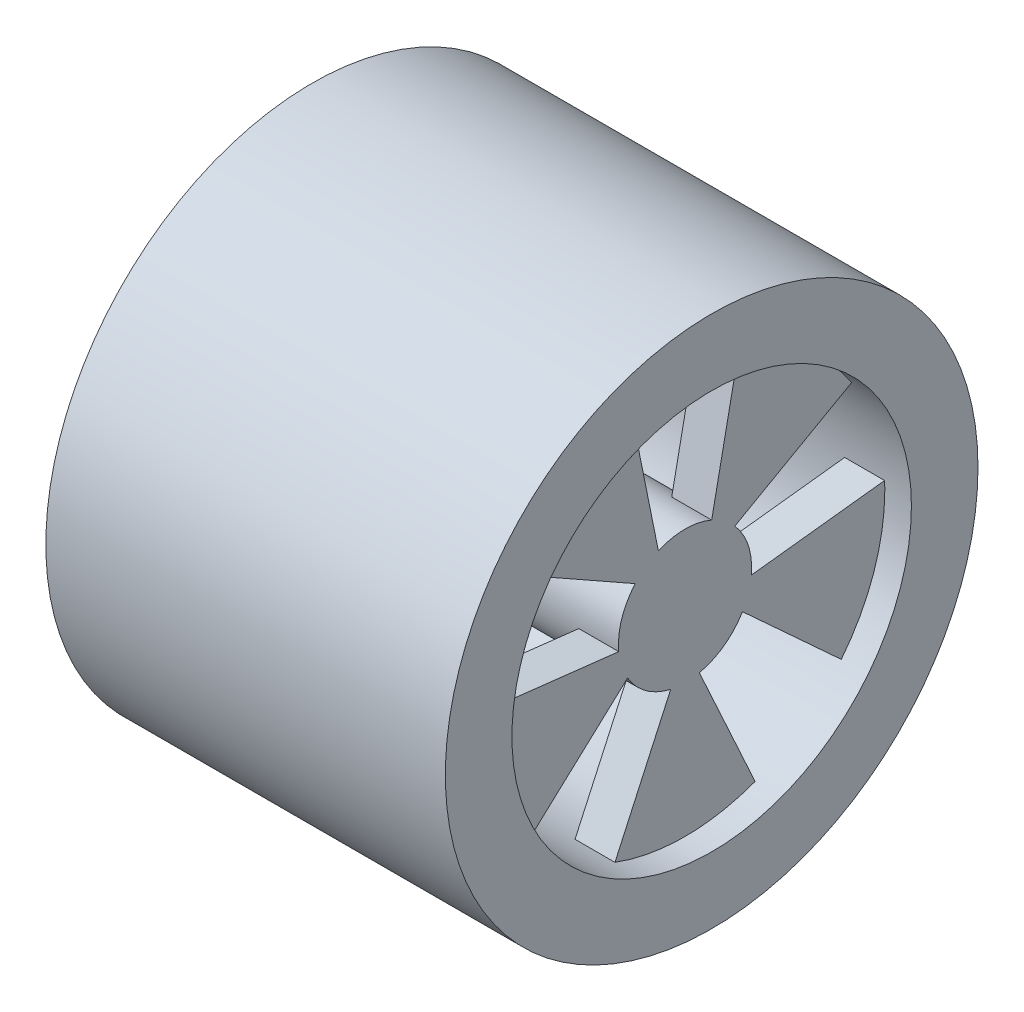
ISO-10303-21;
HEADER;
FILE_DESCRIPTION(('STEP AP214'),'2;1');
FILE_NAME('part.step','',(''),(''),'','','');
FILE_SCHEMA(('AUTOMOTIVE_DESIGN { 1 0 10303 214 1 1 1 1 }'));
ENDSEC;
DATA;
#1=APPLICATION_CONTEXT('core data for automotive mechanical design processes');
#2=APPLICATION_PROTOCOL_DEFINITION('international standard','automotive_design',2000,#1);
#3=PRODUCT_CONTEXT('',#1,'mechanical');
#4=PRODUCT('Part','Part','',(#3));
#5=PRODUCT_RELATED_PRODUCT_CATEGORY('part','',(#4));
#6=PRODUCT_DEFINITION_FORMATION('','',#4);
#7=PRODUCT_DEFINITION_CONTEXT('part definition',#1,'design');
#8=PRODUCT_DEFINITION('design','',#6,#7);
#9=PRODUCT_DEFINITION_SHAPE('','',#8);
#10=(LENGTH_UNIT() NAMED_UNIT(*) SI_UNIT(.MILLI.,.METRE.));
#11=(NAMED_UNIT(*) PLANE_ANGLE_UNIT() SI_UNIT($,.RADIAN.));
#12=(NAMED_UNIT(*) SI_UNIT($,.STERADIAN.) SOLID_ANGLE_UNIT());
#13=UNCERTAINTY_MEASURE_WITH_UNIT(LENGTH_MEASURE(1.E-05),#10,'distance_accuracy_value','');
#14=(GEOMETRIC_REPRESENTATION_CONTEXT(3) GLOBAL_UNCERTAINTY_ASSIGNED_CONTEXT((#13)) GLOBAL_UNIT_ASSIGNED_CONTEXT((#10,
#11,#12)) REPRESENTATION_CONTEXT('',''));
#15=CARTESIAN_POINT('',(0.,0.,0.));
#16=DIRECTION('',(0.,0.,1.));
#17=DIRECTION('',(1.,0.,0.));
#18=AXIS2_PLACEMENT_3D('',#15,#16,#17);
#19=CARTESIAN_POINT('',(-5.,0.,0.));
#20=DIRECTION('',(1.,0.,0.));
#21=DIRECTION('',(0.,0.,-1.));
#22=AXIS2_PLACEMENT_3D('',#19,#20,#21);
#23=CYLINDRICAL_SURFACE('',#22,5.);
#24=CARTESIAN_POINT('',(-5.,0.,0.));
#25=DIRECTION('',(-1.,0.,0.));
#26=DIRECTION('',(0.,0.,1.));
#27=AXIS2_PLACEMENT_3D('',#24,#25,#26);
#28=CIRCLE('',#27,5.);
#29=CARTESIAN_POINT('',(-5.,0.,5.));
#30=VERTEX_POINT('',#29);
#31=EDGE_CURVE('E302',#30,#30,#28,.T.);
#32=ORIENTED_EDGE('',*,*,#31,.F.);
#33=EDGE_LOOP('',(#32));
#34=FACE_BOUND('',#33,.T.);
#35=CARTESIAN_POINT('',(28.,0.,0.));
#36=DIRECTION('',(1.,0.,0.));
#37=DIRECTION('',(0.,0.,-1.));
#38=AXIS2_PLACEMENT_3D('',#35,#36,#37);
#39=CIRCLE('',#38,5.);
#40=CARTESIAN_POINT('',(28.,4.58257569495584,-2.));
#41=VERTEX_POINT('',#40);
#42=CARTESIAN_POINT('',(28.,4.58257569495584,2.));
#43=VERTEX_POINT('',#42);
#44=EDGE_CURVE('E338',#41,#43,#39,.T.);
#45=ORIENTED_EDGE('',*,*,#44,.F.);
#46=DIRECTION('',(1.,0.,0.));
#47=VECTOR('',#46,1.);
#48=CARTESIAN_POINT('',(-5.001,4.58257569495584,-2.));
#49=LINE('',#48,#47);
#50=CARTESIAN_POINT('',(25.,4.58257569495584,-2.));
#51=VERTEX_POINT('',#50);
#52=EDGE_CURVE('E298',#51,#41,#49,.T.);
#53=ORIENTED_EDGE('',*,*,#52,.F.);
#54=CARTESIAN_POINT('',(25.,0.,0.));
#55=DIRECTION('',(1.,0.,0.));
#56=DIRECTION('',(0.,0.,-1.));
#57=AXIS2_PLACEMENT_3D('',#54,#55,#56);
#58=CIRCLE('',#57,5.);
#59=CARTESIAN_POINT('',(25.,3.31820680034167,-3.74025448735327));
#60=VERTEX_POINT('',#59);
#61=EDGE_CURVE('E369',#51,#60,#58,.F.);
#62=ORIENTED_EDGE('',*,*,#61,.T.);
#63=DIRECTION('',(1.,0.,0.));
#64=VECTOR('',#63,1.);
#65=CARTESIAN_POINT('',(-5.001,3.31820680034198,-3.74025448735381));
#66=LINE('',#65,#64);
#67=CARTESIAN_POINT('',(28.,3.31820680034157,-3.74025448735336));
#68=VERTEX_POINT('',#67);
#69=EDGE_CURVE('E244',#60,#68,#66,.T.);
#70=ORIENTED_EDGE('',*,*,#69,.T.);
#71=CARTESIAN_POINT('',(28.,-0.486019264838638,-4.9763224648536));
#72=VERTEX_POINT('',#71);
#73=EDGE_CURVE('E223',#72,#68,#39,.T.);
#74=ORIENTED_EDGE('',*,*,#73,.F.);
#75=DIRECTION('',(1.,0.,0.));
#76=VECTOR('',#75,1.);
#77=CARTESIAN_POINT('',(-5.001,-0.486019264838638,-4.9763224648536));
#78=LINE('',#77,#76);
#79=CARTESIAN_POINT('',(25.,-0.486019264838638,-4.9763224648536));
#80=VERTEX_POINT('',#79);
#81=EDGE_CURVE('E250',#80,#72,#78,.T.);
#82=ORIENTED_EDGE('',*,*,#81,.F.);
#83=CARTESIAN_POINT('',(25.,-2.53181111064285,-4.31160439975949));
#84=VERTEX_POINT('',#83);
#85=EDGE_CURVE('E323',#80,#84,#58,.F.);
#86=ORIENTED_EDGE('',*,*,#85,.T.);
#87=DIRECTION('',(1.,0.,0.));
#88=VECTOR('',#87,1.);
#89=CARTESIAN_POINT('',(-5.001,-2.53181111064311,-4.31160439975977));
#90=LINE('',#89,#88);
#91=CARTESIAN_POINT('',(28.,-2.53181111064292,-4.31160439975945));
#92=VERTEX_POINT('',#91);
#93=EDGE_CURVE('E257',#84,#92,#90,.T.);
#94=ORIENTED_EDGE('',*,*,#93,.T.);
#95=CARTESIAN_POINT('',(28.,-4.88295211981301,-1.07553642225999));
#96=VERTEX_POINT('',#95);
#97=EDGE_CURVE('E339',#96,#92,#39,.T.);
#98=ORIENTED_EDGE('',*,*,#97,.F.);
#99=DIRECTION('',(1.,0.,0.));
#100=VECTOR('',#99,1.);
#101=CARTESIAN_POINT('',(-5.001,-4.88295211981301,-1.07553642225999));
#102=LINE('',#101,#100);
#103=CARTESIAN_POINT('',(25.,-4.88295211981301,-1.07553642225999));
#104=VERTEX_POINT('',#103);
#105=EDGE_CURVE('E247',#104,#96,#102,.T.);
#106=ORIENTED_EDGE('',*,*,#105,.F.);
#107=CARTESIAN_POINT('',(25.,-4.88295211981404,1.07553642225804));
#108=VERTEX_POINT('',#107);
#109=EDGE_CURVE('E368',#104,#108,#58,.F.);
#110=ORIENTED_EDGE('',*,*,#109,.T.);
#111=DIRECTION('',(1.,0.,0.));
#112=VECTOR('',#111,1.);
#113=CARTESIAN_POINT('',(-5.001,-4.88295211981369,1.07553642225788));
#114=LINE('',#113,#112);
#115=CARTESIAN_POINT('',(28.,-4.88295211981405,1.07553642225796));
#116=VERTEX_POINT('',#115);
#117=EDGE_CURVE('E269',#108,#116,#114,.T.);
#118=ORIENTED_EDGE('',*,*,#117,.T.);
#119=CARTESIAN_POINT('',(28.,-2.5318111106438,4.31160439975767));
#120=VERTEX_POINT('',#119);
#121=EDGE_CURVE('E343',#120,#116,#39,.T.);
#122=ORIENTED_EDGE('',*,*,#121,.F.);
#123=DIRECTION('',(1.,0.,0.));
#124=VECTOR('',#123,1.);
#125=CARTESIAN_POINT('',(-5.001,-2.5318111106438,4.31160439975767));
#126=LINE('',#125,#124);
#127=CARTESIAN_POINT('',(25.,-2.5318111106438,4.31160439975767));
#128=VERTEX_POINT('',#127);
#129=EDGE_CURVE('E260',#128,#120,#126,.T.);
#130=ORIENTED_EDGE('',*,*,#129,.F.);
#131=CARTESIAN_POINT('',(25.,-0.486019264839675,4.97632246485341));
#132=VERTEX_POINT('',#131);
#133=EDGE_CURVE('E420',#128,#132,#58,.F.);
#134=ORIENTED_EDGE('',*,*,#133,.T.);
#135=DIRECTION('',(1.,0.,0.));
#136=VECTOR('',#135,1.);
#137=CARTESIAN_POINT('',(-5.001,-0.486019264839745,4.9763224648528));
#138=LINE('',#137,#136);
#139=CARTESIAN_POINT('',(28.,-0.486019264839804,4.9763224648534));
#140=VERTEX_POINT('',#139);
#141=EDGE_CURVE('E281',#132,#140,#138,.T.);
#142=ORIENTED_EDGE('',*,*,#141,.T.);
#143=CARTESIAN_POINT('',(28.,3.31820680034087,3.74025448735301));
#144=VERTEX_POINT('',#143);
#145=EDGE_CURVE('E341',#144,#140,#39,.T.);
#146=ORIENTED_EDGE('',*,*,#145,.F.);
#147=DIRECTION('',(1.,0.,0.));
#148=VECTOR('',#147,1.);
#149=CARTESIAN_POINT('',(-5.001,3.31820680034087,3.74025448735301));
#150=LINE('',#149,#148);
#151=CARTESIAN_POINT('',(25.,3.31820680034087,3.74025448735301));
#152=VERTEX_POINT('',#151);
#153=EDGE_CURVE('E272',#152,#144,#150,.T.);
#154=ORIENTED_EDGE('',*,*,#153,.F.);
#155=CARTESIAN_POINT('',(25.,4.58257569495584,2.));
#156=VERTEX_POINT('',#155);
#157=EDGE_CURVE('E105',#152,#156,#58,.F.);
#158=ORIENTED_EDGE('',*,*,#157,.T.);
#159=DIRECTION('',(1.,0.,0.));
#160=VECTOR('',#159,1.);
#161=CARTESIAN_POINT('',(-5.001,4.58257569495584,2.));
#162=LINE('',#161,#160);
#163=EDGE_CURVE('E299',#156,#43,#162,.T.);
#164=ORIENTED_EDGE('',*,*,#163,.T.);
#165=EDGE_LOOP('',(#45,#53,#62,#70,#74,#82,#86,#94,#98,#106,#110,#118,#122,#130,#134,#142,#146,
#154,#158,#164));
#166=FACE_BOUND('',#165,.T.);
#167=ADVANCED_FACE('F83',(#34,#166),#23,.T.);
#168=CARTESIAN_POINT('',(-5.001,-0.208537210695951,1.02957496451389));
#169=DIRECTION('',(0.,-0.198515744236376,0.980097698849598));
#170=DIRECTION('',(0.,-0.980097698849598,-0.198515744236376));
#171=AXIS2_PLACEMENT_3D('',#168,#169,#170);
#172=PLANE('',#171);
#173=DIRECTION('',(0.,0.980097698849598,0.198515744236376));
#174=VECTOR('',#173,1.);
#175=CARTESIAN_POINT('',(28.,-0.208537210695951,1.02957496451389));
#176=LINE('',#175,#174);
#177=CARTESIAN_POINT('',(28.,14.456832294801,4.));
#178=VERTEX_POINT('',#177);
#179=EDGE_CURVE('E330',#43,#178,#176,.T.);
#180=ORIENTED_EDGE('',*,*,#179,.F.);
#181=ORIENTED_EDGE('',*,*,#163,.F.);
#182=DIRECTION('',(0.,0.980097698849598,0.198515744236376));
#183=VECTOR('',#182,1.);
#184=CARTESIAN_POINT('',(25.,-0.208537210695951,1.02957496451389));
#185=LINE('',#184,#183);
#186=CARTESIAN_POINT('',(25.,14.456832294801,4.));
#187=VERTEX_POINT('',#186);
#188=EDGE_CURVE('E256',#156,#187,#185,.T.);
#189=ORIENTED_EDGE('',*,*,#188,.T.);
#190=DIRECTION('',(1.,0.,0.));
#191=VECTOR('',#190,1.);
#192=CARTESIAN_POINT('',(-5.001,14.456832294801,4.));
#193=LINE('',#192,#191);
#194=EDGE_CURVE('E303',#187,#178,#193,.T.);
#195=ORIENTED_EDGE('',*,*,#194,.T.);
#196=EDGE_LOOP('',(#180,#181,#189,#195));
#197=FACE_BOUND('',#196,.T.);
#198=ADVANCED_FACE('F392',(#197),#172,.F.);
#199=CARTESIAN_POINT('',(-5.001,-0.208537210695951,-1.02957496451389));
#200=DIRECTION('',(0.,0.198515744236376,0.980097698849598));
#201=DIRECTION('',(0.,-0.980097698849598,0.198515744236376));
#202=AXIS2_PLACEMENT_3D('',#199,#200,#201);
#203=PLANE('',#202);
#204=ORIENTED_EDGE('',*,*,#52,.T.);
#205=DIRECTION('',(0.,0.980097698849598,-0.198515744236376));
#206=VECTOR('',#205,1.);
#207=CARTESIAN_POINT('',(28.,-0.208537210695951,-1.02957496451389));
#208=LINE('',#207,#206);
#209=CARTESIAN_POINT('',(28.,14.456832294801,-4.));
#210=VERTEX_POINT('',#209);
#211=EDGE_CURVE('E340',#41,#210,#208,.T.);
#212=ORIENTED_EDGE('',*,*,#211,.T.);
#213=DIRECTION('',(1.,0.,0.));
#214=VECTOR('',#213,1.);
#215=CARTESIAN_POINT('',(-5.001,14.456832294801,-4.));
#216=LINE('',#215,#214);
#217=CARTESIAN_POINT('',(25.,14.456832294801,-4.));
#218=VERTEX_POINT('',#217);
#219=EDGE_CURVE('E238',#218,#210,#216,.T.);
#220=ORIENTED_EDGE('',*,*,#219,.F.);
#221=DIRECTION('',(0.,0.980097698849598,-0.198515744236376));
#222=VECTOR('',#221,1.);
#223=CARTESIAN_POINT('',(25.,-0.208537210695951,-1.02957496451389));
#224=LINE('',#223,#222);
#225=EDGE_CURVE('E386',#51,#218,#224,.T.);
#226=ORIENTED_EDGE('',*,*,#225,.F.);
#227=EDGE_LOOP('',(#204,#212,#220,#226));
#228=FACE_BOUND('',#227,.T.);
#229=ADVANCED_FACE('F417',(#228),#203,.T.);
#230=CARTESIAN_POINT('',(-5.001,-1.04362552108019,0.119825487895411));
#231=DIRECTION('',(0.,-0.993473041716826,0.114067152949118));
#232=DIRECTION('',(0.,-0.114067152949118,-0.993473041716826));
#233=AXIS2_PLACEMENT_3D('',#230,#231,#232);
#234=PLANE('',#233);
#235=DIRECTION('',(0.,0.114067152949118,0.993473041716826));
#236=VECTOR('',#235,1.);
#237=CARTESIAN_POINT('',(28.,-1.04362552108019,0.119825487895411));
#238=LINE('',#237,#236);
#239=CARTESIAN_POINT('',(28.,0.663180798741147,14.9853325364565));
#240=VERTEX_POINT('',#239);
#241=EDGE_CURVE('E357',#140,#240,#238,.T.);
#242=ORIENTED_EDGE('',*,*,#241,.F.);
#243=ORIENTED_EDGE('',*,*,#141,.F.);
#244=DIRECTION('',(0.,0.114067152949118,0.993473041716826));
#245=VECTOR('',#244,1.);
#246=CARTESIAN_POINT('',(25.,-1.04362552108019,0.119825487895411));
#247=LINE('',#246,#245);
#248=CARTESIAN_POINT('',(25.,0.6631807987411,14.9853325364565));
#249=VERTEX_POINT('',#248);
#250=EDGE_CURVE('E383',#132,#249,#247,.T.);
#251=ORIENTED_EDGE('',*,*,#250,.T.);
#252=DIRECTION('',(1.,0.,0.));
#253=VECTOR('',#252,1.);
#254=CARTESIAN_POINT('',(-5.001,0.663180798741071,14.9853325364558));
#255=LINE('',#254,#253);
#256=EDGE_CURVE('E285',#249,#240,#255,.T.);
#257=ORIENTED_EDGE('',*,*,#256,.T.);
#258=EDGE_LOOP('',(#242,#243,#251,#257));
#259=FACE_BOUND('',#258,.T.);
#260=ADVANCED_FACE('F473',(#259),#234,.F.);
#261=CARTESIAN_POINT('',(-5.001,0.914742436950685,-0.516486834140172));
#262=DIRECTION('',(0.,-0.870783564476765,0.491666537235492));
#263=DIRECTION('',(0.,-0.491666537235492,-0.870783564476765));
#264=AXIS2_PLACEMENT_3D('',#261,#262,#263);
#265=PLANE('',#264);
#266=ORIENTED_EDGE('',*,*,#153,.T.);
#267=DIRECTION('',(0.,0.491666537235492,0.870783564476765));
#268=VECTOR('',#267,1.);
#269=CARTESIAN_POINT('',(28.,0.914742436950685,-0.516486834140172));
#270=LINE('',#269,#268);
#271=CARTESIAN_POINT('',(28.,8.27163292910267,12.5131965814569));
#272=VERTEX_POINT('',#271);
#273=EDGE_CURVE('E353',#144,#272,#270,.T.);
#274=ORIENTED_EDGE('',*,*,#273,.T.);
#275=DIRECTION('',(1.,0.,0.));
#276=VECTOR('',#275,1.);
#277=CARTESIAN_POINT('',(-5.001,8.2716329291023,12.5131965814562));
#278=LINE('',#277,#276);
#279=CARTESIAN_POINT('',(25.,8.27163292910267,12.5131965814569));
#280=VERTEX_POINT('',#279);
#281=EDGE_CURVE('E288',#280,#272,#278,.T.);
#282=ORIENTED_EDGE('',*,*,#281,.F.);
#283=DIRECTION('',(0.,0.491666537235492,0.870783564476765));
#284=VECTOR('',#283,1.);
#285=CARTESIAN_POINT('',(25.,0.914742436950685,-0.516486834140172));
#286=LINE('',#285,#284);
#287=EDGE_CURVE('E381',#152,#280,#286,.T.);
#288=ORIENTED_EDGE('',*,*,#287,.F.);
#289=EDGE_LOOP('',(#266,#274,#282,#288));
#290=FACE_BOUND('',#289,.T.);
#291=ADVANCED_FACE('F475',(#290),#265,.T.);
#292=CARTESIAN_POINT('',(-5.001,-0.436458832858675,-0.955518740276965));
#293=DIRECTION('',(0.,-0.415484362451365,-0.909600321327111));
#294=DIRECTION('',(0.,0.909600321327111,-0.415484362451365));
#295=AXIS2_PLACEMENT_3D('',#292,#293,#294);
#296=PLANE('',#295);
#297=DIRECTION('',(0.,-0.909600321327111,0.415484362451365));
#298=VECTOR('',#297,1.);
#299=CARTESIAN_POINT('',(28.,-0.436458832858675,-0.955518740276965));
#300=LINE('',#299,#298);
#301=CARTESIAN_POINT('',(28.,-14.0469640204928,5.26144484024878));
#302=VERTEX_POINT('',#301);
#303=EDGE_CURVE('E350',#116,#302,#300,.T.);
#304=ORIENTED_EDGE('',*,*,#303,.F.);
#305=ORIENTED_EDGE('',*,*,#117,.F.);
#306=DIRECTION('',(0.,-0.909600321327111,0.415484362451365));
#307=VECTOR('',#306,1.);
#308=CARTESIAN_POINT('',(25.,-0.436458832858675,-0.955518740276965));
#309=LINE('',#308,#307);
#310=CARTESIAN_POINT('',(25.,-14.0469640204928,5.26144484024875));
#311=VERTEX_POINT('',#310);
#312=EDGE_CURVE('E378',#108,#311,#309,.T.);
#313=ORIENTED_EDGE('',*,*,#312,.T.);
#314=DIRECTION('',(1.,0.,0.));
#315=VECTOR('',#314,1.);
#316=CARTESIAN_POINT('',(-5.001,-14.0469640204923,5.26144484024856));
#317=LINE('',#316,#315);
#318=EDGE_CURVE('E273',#311,#302,#317,.T.);
#319=ORIENTED_EDGE('',*,*,#318,.T.);
#320=EDGE_LOOP('',(#304,#305,#313,#319));
#321=FACE_BOUND('',#320,.T.);
#322=ADVANCED_FACE('F427',(#321),#296,.F.);
#323=CARTESIAN_POINT('',(-5.001,0.773879127682853,0.710368546272945));
#324=DIRECTION('',(0.,-0.736689583927802,-0.676231067707099));
#325=DIRECTION('',(0.,0.676231067707099,-0.736689583927802));
#326=AXIS2_PLACEMENT_3D('',#323,#324,#325);
#327=PLANE('',#326);
#328=ORIENTED_EDGE('',*,*,#129,.T.);
#329=DIRECTION('',(0.,-0.676231067707099,0.736689583927802));
#330=VECTOR('',#329,1.);
#331=CARTESIAN_POINT('',(28.,0.773879127682853,0.710368546272945));
#332=LINE('',#331,#330);
#333=CARTESIAN_POINT('',(28.,-9.34468200215323,11.7335807952489));
#334=VERTEX_POINT('',#333);
#335=EDGE_CURVE('E346',#120,#334,#332,.T.);
#336=ORIENTED_EDGE('',*,*,#335,.T.);
#337=DIRECTION('',(1.,0.,0.));
#338=VECTOR('',#337,1.);
#339=CARTESIAN_POINT('',(-5.001,-9.34468200215255,11.7335807952481));
#340=LINE('',#339,#338);
#341=CARTESIAN_POINT('',(25.,-9.34468200215323,11.7335807952489));
#342=VERTEX_POINT('',#341);
#343=EDGE_CURVE('E276',#342,#334,#340,.T.);
#344=ORIENTED_EDGE('',*,*,#343,.F.);
#345=DIRECTION('',(0.,-0.676231067707099,0.736689583927802));
#346=VECTOR('',#345,1.);
#347=CARTESIAN_POINT('',(25.,0.773879127682853,0.710368546272945));
#348=LINE('',#347,#346);
#349=EDGE_CURVE('E376',#128,#342,#348,.T.);
#350=ORIENTED_EDGE('',*,*,#349,.F.);
#351=EDGE_LOOP('',(#328,#336,#344,#350));
#352=FACE_BOUND('',#351,.T.);
#353=ADVANCED_FACE('F540',(#352),#327,.T.);
#354=CARTESIAN_POINT('',(-5.001,0.773879127684274,-0.710368546274249));
#355=DIRECTION('',(0.,0.736689583927802,-0.676231067707098));
#356=DIRECTION('',(0.,0.676231067707098,0.736689583927802));
#357=AXIS2_PLACEMENT_3D('',#354,#355,#356);
#358=PLANE('',#357);
#359=DIRECTION('',(0.,-0.676231067707098,-0.736689583927802));
#360=VECTOR('',#359,1.);
#361=CARTESIAN_POINT('',(28.,0.773879127684274,-0.710368546274249));
#362=LINE('',#361,#360);
#363=CARTESIAN_POINT('',(28.,-9.34468200215171,-11.7335807952501));
#364=VERTEX_POINT('',#363);
#365=EDGE_CURVE('E342',#92,#364,#362,.T.);
#366=ORIENTED_EDGE('',*,*,#365,.F.);
#367=ORIENTED_EDGE('',*,*,#93,.F.);
#368=DIRECTION('',(0.,-0.676231067707098,-0.736689583927802));
#369=VECTOR('',#368,1.);
#370=CARTESIAN_POINT('',(25.,0.773879127684274,-0.710368546274249));
#371=LINE('',#370,#369);
#372=CARTESIAN_POINT('',(25.,-9.34468200215172,-11.7335807952501));
#373=VERTEX_POINT('',#372);
#374=EDGE_CURVE('E374',#84,#373,#371,.T.);
#375=ORIENTED_EDGE('',*,*,#374,.T.);
#376=DIRECTION('',(1.,0.,0.));
#377=VECTOR('',#376,1.);
#378=CARTESIAN_POINT('',(-5.001,-9.34468200215185,-11.7335807952503));
#379=LINE('',#378,#377);
#380=EDGE_CURVE('E261',#373,#364,#379,.T.);
#381=ORIENTED_EDGE('',*,*,#380,.T.);
#382=EDGE_LOOP('',(#366,#367,#375,#381));
#383=FACE_BOUND('',#382,.T.);
#384=ADVANCED_FACE('F531',(#383),#358,.F.);
#385=CARTESIAN_POINT('',(-5.001,-0.436458832857761,0.955518740274963));
#386=DIRECTION('',(0.,0.415484362451365,-0.90960032132711));
#387=DIRECTION('',(0.,0.90960032132711,0.415484362451365));
#388=AXIS2_PLACEMENT_3D('',#385,#386,#387);
#389=PLANE('',#388);
#390=ORIENTED_EDGE('',*,*,#105,.T.);
#391=DIRECTION('',(0.,-0.90960032132711,-0.415484362451365));
#392=VECTOR('',#391,1.);
#393=CARTESIAN_POINT('',(28.,-0.436458832857761,0.955518740274963));
#394=LINE('',#393,#392);
#395=CARTESIAN_POINT('',(28.,-14.046964020492,-5.26144484025085));
#396=VERTEX_POINT('',#395);
#397=EDGE_CURVE('E228',#96,#396,#394,.T.);
#398=ORIENTED_EDGE('',*,*,#397,.T.);
#399=DIRECTION('',(1.,0.,0.));
#400=VECTOR('',#399,1.);
#401=CARTESIAN_POINT('',(-5.001,-14.0469640204916,-5.26144484025067));
#402=LINE('',#401,#400);
#403=CARTESIAN_POINT('',(25.,-14.046964020492,-5.26144484025085));
#404=VERTEX_POINT('',#403);
#405=EDGE_CURVE('E264',#404,#396,#402,.T.);
#406=ORIENTED_EDGE('',*,*,#405,.F.);
#407=DIRECTION('',(0.,-0.90960032132711,-0.415484362451365));
#408=VECTOR('',#407,1.);
#409=CARTESIAN_POINT('',(25.,-0.436458832857761,0.955518740274963));
#410=LINE('',#409,#408);
#411=EDGE_CURVE('E372',#104,#404,#410,.T.);
#412=ORIENTED_EDGE('',*,*,#411,.F.);
#413=EDGE_LOOP('',(#390,#398,#406,#412));
#414=FACE_BOUND('',#413,.T.);
#415=ADVANCED_FACE('F404',(#414),#389,.T.);
#416=CARTESIAN_POINT('',(-5.001,0.914742436951178,0.51648683414045));
#417=DIRECTION('',(0.,0.870783564476765,0.491666537235492));
#418=DIRECTION('',(0.,-0.491666537235492,0.870783564476765));
#419=AXIS2_PLACEMENT_3D('',#416,#417,#418);
#420=PLANE('',#419);
#421=DIRECTION('',(0.,0.491666537235492,-0.870783564476765));
#422=VECTOR('',#421,1.);
#423=CARTESIAN_POINT('',(28.,0.914742436951178,0.51648683414045));
#424=LINE('',#423,#422);
#425=CARTESIAN_POINT('',(28.,8.27163292910315,-12.5131965814566));
#426=VERTEX_POINT('',#425);
#427=EDGE_CURVE('E217',#68,#426,#424,.T.);
#428=ORIENTED_EDGE('',*,*,#427,.F.);
#429=ORIENTED_EDGE('',*,*,#69,.F.);
#430=DIRECTION('',(0.,0.491666537235492,-0.870783564476765));
#431=VECTOR('',#430,1.);
#432=CARTESIAN_POINT('',(25.,0.914742436951178,0.51648683414045));
#433=LINE('',#432,#431);
#434=CARTESIAN_POINT('',(25.,8.27163292910341,-12.513196581457));
#435=VERTEX_POINT('',#434);
#436=EDGE_CURVE('E243',#60,#435,#433,.T.);
#437=ORIENTED_EDGE('',*,*,#436,.T.);
#438=DIRECTION('',(1.,0.,0.));
#439=VECTOR('',#438,1.);
#440=CARTESIAN_POINT('',(-5.001,8.27163292910341,-12.513196581457));
#441=LINE('',#440,#439);
#442=EDGE_CURVE('E236',#435,#426,#441,.T.);
#443=ORIENTED_EDGE('',*,*,#442,.T.);
#444=EDGE_LOOP('',(#428,#429,#437,#443));
#445=FACE_BOUND('',#444,.T.);
#446=ADVANCED_FACE('F242',(#445),#420,.F.);
#447=CARTESIAN_POINT('',(-5.001,-1.04362552107919,-0.119825487895297));
#448=DIRECTION('',(0.,0.993473041716826,0.114067152949118));
#449=DIRECTION('',(0.,-0.114067152949118,0.993473041716826));
#450=AXIS2_PLACEMENT_3D('',#447,#448,#449);
#451=PLANE('',#450);
#452=ORIENTED_EDGE('',*,*,#81,.T.);
#453=DIRECTION('',(0.,0.114067152949118,-0.993473041716826));
#454=VECTOR('',#453,1.);
#455=CARTESIAN_POINT('',(28.,-1.04362552107919,-0.119825487895297));
#456=LINE('',#455,#454);
#457=CARTESIAN_POINT('',(28.,0.663180798742182,-14.9853325364566));
#458=VERTEX_POINT('',#457);
#459=EDGE_CURVE('E13',#72,#458,#456,.T.);
#460=ORIENTED_EDGE('',*,*,#459,.T.);
#461=DIRECTION('',(1.,0.,0.));
#462=VECTOR('',#461,1.);
#463=CARTESIAN_POINT('',(-5.001,0.663180798742182,-14.9853325364566));
#464=LINE('',#463,#462);
#465=CARTESIAN_POINT('',(25.,0.66318079874216,-14.9853325364564));
#466=VERTEX_POINT('',#465);
#467=EDGE_CURVE('E245',#466,#458,#464,.T.);
#468=ORIENTED_EDGE('',*,*,#467,.F.);
#469=DIRECTION('',(0.,0.114067152949118,-0.993473041716826));
#470=VECTOR('',#469,1.);
#471=CARTESIAN_POINT('',(25.,-1.04362552107919,-0.119825487895297));
#472=LINE('',#471,#470);
#473=EDGE_CURVE('E91',#80,#466,#472,.T.);
#474=ORIENTED_EDGE('',*,*,#473,.F.);
#475=EDGE_LOOP('',(#452,#460,#468,#474));
#476=FACE_BOUND('',#475,.T.);
#477=ADVANCED_FACE('F333',(#476),#451,.T.);
#478=CARTESIAN_POINT('',(30.,0.,0.));
#479=DIRECTION('',(1.,0.,0.));
#480=DIRECTION('',(0.,0.,-1.));
#481=AXIS2_PLACEMENT_3D('',#478,#479,#480);
#482=PLANE('',#481);
#483=CARTESIAN_POINT('',(30.,0.,0.));
#484=DIRECTION('',(1.,0.,0.));
#485=DIRECTION('',(0.,0.,-1.));
#486=AXIS2_PLACEMENT_3D('',#483,#484,#485);
#487=CIRCLE('',#486,15.);
#488=CARTESIAN_POINT('',(30.,0.,-15.));
#489=VERTEX_POINT('',#488);
#490=EDGE_CURVE('E295',#489,#489,#487,.T.);
#491=ORIENTED_EDGE('',*,*,#490,.F.);
#492=EDGE_LOOP('',(#491));
#493=FACE_BOUND('',#492,.T.);
#494=CARTESIAN_POINT('',(30.,0.,0.));
#495=DIRECTION('',(1.,0.,0.));
#496=DIRECTION('',(0.,0.,-1.));
#497=AXIS2_PLACEMENT_3D('',#494,#495,#496);
#498=CIRCLE('',#497,20.);
#499=CARTESIAN_POINT('',(30.,0.,-20.));
#500=VERTEX_POINT('',#499);
#501=EDGE_CURVE('E312',#500,#500,#498,.T.);
#502=ORIENTED_EDGE('',*,*,#501,.T.);
#503=EDGE_LOOP('',(#502));
#504=FACE_BOUND('',#503,.T.);
#505=ADVANCED_FACE('F452',(#493,#504),#482,.T.);
#506=CARTESIAN_POINT('',(0.,0.,0.));
#507=DIRECTION('',(1.,0.,0.));
#508=DIRECTION('',(0.,0.,-1.));
#509=AXIS2_PLACEMENT_3D('',#506,#507,#508);
#510=PLANE('',#509);
#511=CARTESIAN_POINT('',(0.,0.,0.));
#512=DIRECTION('',(1.,0.,0.));
#513=DIRECTION('',(0.,0.,-1.));
#514=AXIS2_PLACEMENT_3D('',#511,#512,#513);
#515=CIRCLE('',#514,20.);
#516=CARTESIAN_POINT('',(0.,0.,-20.));
#517=VERTEX_POINT('',#516);
#518=EDGE_CURVE('E311',#517,#517,#515,.T.);
#519=ORIENTED_EDGE('',*,*,#518,.F.);
#520=EDGE_LOOP('',(#519));
#521=FACE_BOUND('',#520,.T.);
#522=CARTESIAN_POINT('',(0.,0.,0.));
#523=DIRECTION('',(1.,0.,0.));
#524=DIRECTION('',(0.,0.,-1.));
#525=AXIS2_PLACEMENT_3D('',#522,#523,#524);
#526=CIRCLE('',#525,15.);
#527=CARTESIAN_POINT('',(0.,0.,-15.));
#528=VERTEX_POINT('',#527);
#529=EDGE_CURVE('E284',#528,#528,#526,.F.);
#530=ORIENTED_EDGE('',*,*,#529,.F.);
#531=EDGE_LOOP('',(#530));
#532=FACE_BOUND('',#531,.T.);
#533=ADVANCED_FACE('F454',(#521,#532),#510,.F.);
#534=CARTESIAN_POINT('',(30.,0.,0.));
#535=DIRECTION('',(-1.,0.,0.));
#536=DIRECTION('',(0.,0.,1.));
#537=AXIS2_PLACEMENT_3D('',#534,#535,#536);
#538=CYLINDRICAL_SURFACE('',#537,20.);
#539=ORIENTED_EDGE('',*,*,#501,.F.);
#540=EDGE_LOOP('',(#539));
#541=FACE_BOUND('',#540,.T.);
#542=ORIENTED_EDGE('',*,*,#518,.T.);
#543=EDGE_LOOP('',(#542));
#544=FACE_BOUND('',#543,.T.);
#545=ADVANCED_FACE('F85',(#541,#544),#538,.T.);
#546=CARTESIAN_POINT('',(-5.,0.,0.));
#547=DIRECTION('',(-1.,0.,0.));
#548=DIRECTION('',(0.,0.,1.));
#549=AXIS2_PLACEMENT_3D('',#546,#547,#548);
#550=PLANE('',#549);
#551=ORIENTED_EDGE('',*,*,#31,.T.);
#552=EDGE_LOOP('',(#551));
#553=FACE_BOUND('',#552,.T.);
#554=ADVANCED_FACE('F450',(#553),#550,.T.);
#555=CARTESIAN_POINT('',(-5.001,0.,0.));
#556=DIRECTION('',(1.,0.,0.));
#557=DIRECTION('',(0.,0.,-1.));
#558=AXIS2_PLACEMENT_3D('',#555,#556,#557);
#559=CYLINDRICAL_SURFACE('',#558,15.);
#560=CARTESIAN_POINT('',(28.,0.,0.));
#561=DIRECTION('',(1.,0.,0.));
#562=DIRECTION('',(0.,0.,-1.));
#563=AXIS2_PLACEMENT_3D('',#560,#561,#562);
#564=CIRCLE('',#563,15.);
#565=EDGE_CURVE('E239',#178,#272,#564,.T.);
#566=ORIENTED_EDGE('',*,*,#565,.F.);
#567=ORIENTED_EDGE('',*,*,#194,.F.);
#568=CARTESIAN_POINT('',(25.,0.,0.));
#569=DIRECTION('',(1.,0.,0.));
#570=DIRECTION('',(0.,0.,-1.));
#571=AXIS2_PLACEMENT_3D('',#568,#569,#570);
#572=CIRCLE('',#571,15.);
#573=EDGE_CURVE('E397',#280,#187,#572,.F.);
#574=ORIENTED_EDGE('',*,*,#573,.F.);
#575=ORIENTED_EDGE('',*,*,#281,.T.);
#576=EDGE_LOOP('',(#566,#567,#574,#575));
#577=FACE_BOUND('',#576,.T.);
#578=ORIENTED_EDGE('',*,*,#405,.T.);
#579=EDGE_CURVE('E399',#302,#396,#564,.T.);
#580=ORIENTED_EDGE('',*,*,#579,.F.);
#581=ORIENTED_EDGE('',*,*,#318,.F.);
#582=EDGE_CURVE('E332',#404,#311,#572,.F.);
#583=ORIENTED_EDGE('',*,*,#582,.F.);
#584=EDGE_LOOP('',(#578,#580,#581,#583));
#585=FACE_BOUND('',#584,.T.);
#586=ORIENTED_EDGE('',*,*,#343,.T.);
#587=EDGE_CURVE('E398',#240,#334,#564,.T.);
#588=ORIENTED_EDGE('',*,*,#587,.F.);
#589=ORIENTED_EDGE('',*,*,#256,.F.);
#590=EDGE_CURVE('E410',#342,#249,#572,.F.);
#591=ORIENTED_EDGE('',*,*,#590,.F.);
#592=EDGE_LOOP('',(#586,#588,#589,#591));
#593=FACE_BOUND('',#592,.T.);
#594=ORIENTED_EDGE('',*,*,#490,.T.);
#595=EDGE_LOOP('',(#594));
#596=FACE_BOUND('',#595,.T.);
#597=ORIENTED_EDGE('',*,*,#219,.T.);
#598=EDGE_CURVE('E220',#426,#210,#564,.T.);
#599=ORIENTED_EDGE('',*,*,#598,.F.);
#600=ORIENTED_EDGE('',*,*,#442,.F.);
#601=EDGE_CURVE('E329',#218,#435,#572,.F.);
#602=ORIENTED_EDGE('',*,*,#601,.F.);
#603=EDGE_LOOP('',(#597,#599,#600,#602));
#604=FACE_BOUND('',#603,.T.);
#605=EDGE_CURVE('E98',#364,#458,#564,.T.);
#606=ORIENTED_EDGE('',*,*,#605,.F.);
#607=ORIENTED_EDGE('',*,*,#380,.F.);
#608=EDGE_CURVE('E320',#466,#373,#572,.F.);
#609=ORIENTED_EDGE('',*,*,#608,.F.);
#610=ORIENTED_EDGE('',*,*,#467,.T.);
#611=EDGE_LOOP('',(#606,#607,#609,#610));
#612=FACE_BOUND('',#611,.T.);
#613=ORIENTED_EDGE('',*,*,#529,.T.);
#614=EDGE_LOOP('',(#613));
#615=FACE_BOUND('',#614,.T.);
#616=ADVANCED_FACE('F233',(#577,#585,#593,#596,#604,#612,#615),#559,.F.);
#617=CARTESIAN_POINT('',(25.,0.,0.));
#618=DIRECTION('',(1.,0.,0.));
#619=DIRECTION('',(0.,0.,-1.));
#620=AXIS2_PLACEMENT_3D('',#617,#618,#619);
#621=PLANE('',#620);
#622=ORIENTED_EDGE('',*,*,#85,.F.);
#623=ORIENTED_EDGE('',*,*,#473,.T.);
#624=ORIENTED_EDGE('',*,*,#608,.T.);
#625=ORIENTED_EDGE('',*,*,#374,.F.);
#626=EDGE_LOOP('',(#622,#623,#624,#625));
#627=FACE_BOUND('',#626,.T.);
#628=ADVANCED_FACE('F319',(#627),#621,.F.);
#629=ORIENTED_EDGE('',*,*,#225,.T.);
#630=ORIENTED_EDGE('',*,*,#601,.T.);
#631=ORIENTED_EDGE('',*,*,#436,.F.);
#632=ORIENTED_EDGE('',*,*,#61,.F.);
#633=EDGE_LOOP('',(#629,#630,#631,#632));
#634=FACE_BOUND('',#633,.T.);
#635=ADVANCED_FACE('F414',(#634),#621,.F.);
#636=ORIENTED_EDGE('',*,*,#109,.F.);
#637=ORIENTED_EDGE('',*,*,#411,.T.);
#638=ORIENTED_EDGE('',*,*,#582,.T.);
#639=ORIENTED_EDGE('',*,*,#312,.F.);
#640=EDGE_LOOP('',(#636,#637,#638,#639));
#641=FACE_BOUND('',#640,.T.);
#642=ADVANCED_FACE('F428',(#641),#621,.F.);
#643=ORIENTED_EDGE('',*,*,#133,.F.);
#644=ORIENTED_EDGE('',*,*,#349,.T.);
#645=ORIENTED_EDGE('',*,*,#590,.T.);
#646=ORIENTED_EDGE('',*,*,#250,.F.);
#647=EDGE_LOOP('',(#643,#644,#645,#646));
#648=FACE_BOUND('',#647,.T.);
#649=ADVANCED_FACE('F430',(#648),#621,.F.);
#650=ORIENTED_EDGE('',*,*,#157,.F.);
#651=ORIENTED_EDGE('',*,*,#287,.T.);
#652=ORIENTED_EDGE('',*,*,#573,.T.);
#653=ORIENTED_EDGE('',*,*,#188,.F.);
#654=EDGE_LOOP('',(#650,#651,#652,#653));
#655=FACE_BOUND('',#654,.T.);
#656=ADVANCED_FACE('F436',(#655),#621,.F.);
#657=CARTESIAN_POINT('',(28.,0.,0.));
#658=DIRECTION('',(1.,0.,0.));
#659=DIRECTION('',(0.,0.,-1.));
#660=AXIS2_PLACEMENT_3D('',#657,#658,#659);
#661=PLANE('',#660);
#662=ORIENTED_EDGE('',*,*,#179,.T.);
#663=ORIENTED_EDGE('',*,*,#565,.T.);
#664=ORIENTED_EDGE('',*,*,#273,.F.);
#665=ORIENTED_EDGE('',*,*,#145,.T.);
#666=ORIENTED_EDGE('',*,*,#241,.T.);
#667=ORIENTED_EDGE('',*,*,#587,.T.);
#668=ORIENTED_EDGE('',*,*,#335,.F.);
#669=ORIENTED_EDGE('',*,*,#121,.T.);
#670=ORIENTED_EDGE('',*,*,#303,.T.);
#671=ORIENTED_EDGE('',*,*,#579,.T.);
#672=ORIENTED_EDGE('',*,*,#397,.F.);
#673=ORIENTED_EDGE('',*,*,#97,.T.);
#674=ORIENTED_EDGE('',*,*,#365,.T.);
#675=ORIENTED_EDGE('',*,*,#605,.T.);
#676=ORIENTED_EDGE('',*,*,#459,.F.);
#677=ORIENTED_EDGE('',*,*,#73,.T.);
#678=ORIENTED_EDGE('',*,*,#427,.T.);
#679=ORIENTED_EDGE('',*,*,#598,.T.);
#680=ORIENTED_EDGE('',*,*,#211,.F.);
#681=ORIENTED_EDGE('',*,*,#44,.T.);
#682=EDGE_LOOP('',(#662,#663,#664,#665,#666,#667,#668,#669,#670,#671,#672,#673,#674,#675,#676,
#677,#678,#679,#680,#681));
#683=FACE_BOUND('',#682,.T.);
#684=ADVANCED_FACE('F219',(#683),#661,.T.);
#685=CLOSED_SHELL('',(#167,#198,#229,#260,#291,#322,#353,#384,#415,#446,#477,#505,#533,#545,
#554,#616,#628,#635,#642,#649,#656,#684));
#686=MANIFOLD_SOLID_BREP('B2',#685);
#687=ADVANCED_BREP_SHAPE_REPRESENTATION('',(#18,#686),#14);
#688=SHAPE_DEFINITION_REPRESENTATION(#9,#687);
ENDSEC;
END-ISO-10303-21;
